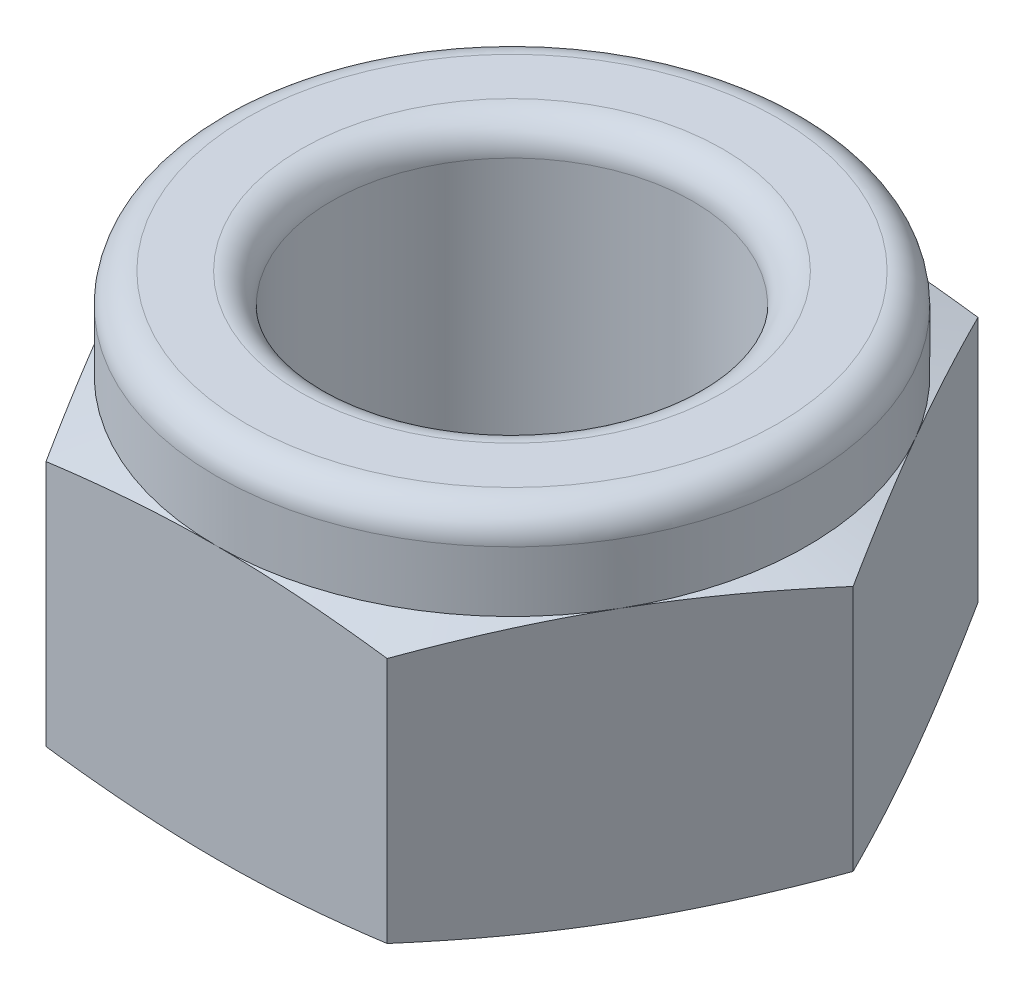
ISO-10303-21;
HEADER;
FILE_DESCRIPTION(('STEP AP214'),'2;1');
FILE_NAME('part.step','',(''),(''),'','','');
FILE_SCHEMA(('AUTOMOTIVE_DESIGN { 1 0 10303 214 1 1 1 1 }'));
ENDSEC;
DATA;
#1=APPLICATION_CONTEXT('core data for automotive mechanical design processes');
#2=APPLICATION_PROTOCOL_DEFINITION('international standard','automotive_design',2000,#1);
#3=PRODUCT_CONTEXT('',#1,'mechanical');
#4=PRODUCT('Part','Part','',(#3));
#5=PRODUCT_RELATED_PRODUCT_CATEGORY('part','',(#4));
#6=PRODUCT_DEFINITION_FORMATION('','',#4);
#7=PRODUCT_DEFINITION_CONTEXT('part definition',#1,'design');
#8=PRODUCT_DEFINITION('design','',#6,#7);
#9=PRODUCT_DEFINITION_SHAPE('','',#8);
#10=(LENGTH_UNIT() NAMED_UNIT(*) SI_UNIT(.MILLI.,.METRE.));
#11=(NAMED_UNIT(*) PLANE_ANGLE_UNIT() SI_UNIT($,.RADIAN.));
#12=(NAMED_UNIT(*) SI_UNIT($,.STERADIAN.) SOLID_ANGLE_UNIT());
#13=UNCERTAINTY_MEASURE_WITH_UNIT(LENGTH_MEASURE(1.E-05),#10,'distance_accuracy_value','');
#14=(GEOMETRIC_REPRESENTATION_CONTEXT(3) GLOBAL_UNCERTAINTY_ASSIGNED_CONTEXT((#13)) GLOBAL_UNIT_ASSIGNED_CONTEXT((#10,
#11,#12)) REPRESENTATION_CONTEXT('',''));
#15=CARTESIAN_POINT('',(0.,0.,0.));
#16=DIRECTION('',(0.,0.,1.));
#17=DIRECTION('',(1.,0.,0.));
#18=AXIS2_PLACEMENT_3D('',#15,#16,#17);
#19=CARTESIAN_POINT('',(2.82901631902917,2.25,4.9));
#20=DIRECTION('',(-0.866025403784439,0.,-0.5));
#21=DIRECTION('',(-0.5,0.,0.866025403784439));
#22=AXIS2_PLACEMENT_3D('',#19,#20,#21);
#23=PLANE('',#22);
#24=CARTESIAN_POINT('',(5.65814810811217,-2.04685482574104,-0.000199999999996387));
#25=CARTESIAN_POINT('',(5.54065660374499,-2.07835041652694,0.203301255021666));
#26=CARTESIAN_POINT('',(5.42295206823452,-2.10694325817324,0.407171490807086));
#27=CARTESIAN_POINT('',(5.18712729832681,-2.15717825137329,0.815631973970481));
#28=CARTESIAN_POINT('',(5.06900691470554,-2.17881757945266,1.02022247981204));
#29=CARTESIAN_POINT('',(4.83306664212638,-2.21388221078127,1.4288830194708));
#30=CARTESIAN_POINT('',(4.71524834873211,-2.22734933171967,1.63295028969074));
#31=CARTESIAN_POINT('',(4.47946150740952,-2.24540736758631,2.04134507861765));
#32=CARTESIAN_POINT('',(4.36149299297663,-2.25,2.24567253930882));
#33=CARTESIAN_POINT('',(4.12555596411087,-2.25,2.65432746069118));
#34=CARTESIAN_POINT('',(4.00758744967798,-2.24540736758631,2.85865492138235));
#35=CARTESIAN_POINT('',(3.77180060835539,-2.22734933171967,3.26704971030926));
#36=CARTESIAN_POINT('',(3.65398231496112,-2.21388221078127,3.47111698052921));
#37=CARTESIAN_POINT('',(3.41804204238195,-2.17881757945266,3.87977752018796));
#38=CARTESIAN_POINT('',(3.29992165876069,-2.15717825137329,4.08436802602952));
#39=CARTESIAN_POINT('',(3.06409688885298,-2.10694325817324,4.49282850919292));
#40=CARTESIAN_POINT('',(2.94639235334251,-2.07835041652694,4.69669874497834));
#41=CARTESIAN_POINT('',(2.82890084897533,-2.04685482574104,4.9002));
#42=B_SPLINE_CURVE_WITH_KNOTS('',3,(#24,#25,#26,#27,#28,#29,#30,#31,#32,#33,#34,#35,#36,#37,#38,
#39,#40,#41),.UNSPECIFIED.,.F.,.F.,(4,2,2,2,2,2,2,2,4),(0.,0.711290304723069,1.4228690650011,
2.13077523457241,2.83854438888412,3.54631354319584,4.25421971276715,4.96579847304517,
5.67708877776824),.UNSPECIFIED.);
#43=CARTESIAN_POINT('',(5.65803263805833,-2.04688576679584,0.));
#44=VERTEX_POINT('',#43);
#45=CARTESIAN_POINT('',(4.24352447854375,-2.25,2.45));
#46=VERTEX_POINT('',#45);
#47=EDGE_CURVE('E49',#44,#46,#42,.T.);
#48=ORIENTED_EDGE('',*,*,#47,.F.);
#49=DIRECTION('',(0.,-1.,0.));
#50=VECTOR('',#49,1.);
#51=CARTESIAN_POINT('',(5.65803263805833,2.25,0.));
#52=LINE('',#51,#50);
#53=CARTESIAN_POINT('',(5.65803263805833,2.04688576679584,0.));
#54=VERTEX_POINT('',#53);
#55=EDGE_CURVE('E314',#54,#44,#52,.T.);
#56=ORIENTED_EDGE('',*,*,#55,.F.);
#57=CARTESIAN_POINT('',(2.82890084897533,2.04685482574104,4.9002));
#58=CARTESIAN_POINT('',(2.94639235334251,2.07835041652694,4.69669874497834));
#59=CARTESIAN_POINT('',(3.06409688885298,2.10694325817324,4.49282850919291));
#60=CARTESIAN_POINT('',(3.29992165876069,2.15717825137329,4.08436802602952));
#61=CARTESIAN_POINT('',(3.41804204238196,2.17881757945266,3.87977752018796));
#62=CARTESIAN_POINT('',(3.65398231496112,2.21388221078127,3.47111698052921));
#63=CARTESIAN_POINT('',(3.77180060835539,2.22734933171967,3.26704971030926));
#64=CARTESIAN_POINT('',(4.00758744967798,2.24540736758631,2.85865492138235));
#65=CARTESIAN_POINT('',(4.12555596411087,2.25,2.65432746069118));
#66=CARTESIAN_POINT('',(4.36149299297663,2.25,2.24567253930882));
#67=CARTESIAN_POINT('',(4.47946150740952,2.24540736758631,2.04134507861765));
#68=CARTESIAN_POINT('',(4.71524834873211,2.22734933171967,1.63295028969074));
#69=CARTESIAN_POINT('',(4.83306664212639,2.21388221078127,1.42888301947079));
#70=CARTESIAN_POINT('',(5.06900691470555,2.17881757945266,1.02022247981204));
#71=CARTESIAN_POINT('',(5.18712729832681,2.15717825137329,0.81563197397048));
#72=CARTESIAN_POINT('',(5.42295206823452,2.10694325817324,0.407171490807085));
#73=CARTESIAN_POINT('',(5.54065660374499,2.07835041652693,0.203301255021665));
#74=CARTESIAN_POINT('',(5.65814810811217,2.04685482574104,-0.000199999999997785));
#75=B_SPLINE_CURVE_WITH_KNOTS('',3,(#57,#58,#59,#60,#61,#62,#63,#64,#65,#66,#67,#68,#69,#70,#71,
#72,#73,#74),.UNSPECIFIED.,.F.,.F.,(4,2,2,2,2,2,2,2,4),(0.,0.71129030472307,1.4228690650011,
2.13077523457241,2.83854438888412,3.54631354319584,4.25421971276715,4.96579847304517,
5.67708877776824),.UNSPECIFIED.);
#76=CARTESIAN_POINT('',(4.24352447854375,2.25,2.45));
#77=VERTEX_POINT('',#76);
#78=EDGE_CURVE('E144',#77,#54,#75,.T.);
#79=ORIENTED_EDGE('',*,*,#78,.F.);
#80=CARTESIAN_POINT('',(2.82901631902917,2.04688576679584,4.9));
#81=VERTEX_POINT('',#80);
#82=EDGE_CURVE('E158',#81,#77,#75,.T.);
#83=ORIENTED_EDGE('',*,*,#82,.F.);
#84=DIRECTION('',(0.,-1.,0.));
#85=VECTOR('',#84,1.);
#86=CARTESIAN_POINT('',(2.82901631902917,2.25,4.9));
#87=LINE('',#86,#85);
#88=CARTESIAN_POINT('',(2.82901631902917,-2.04688576679584,4.9));
#89=VERTEX_POINT('',#88);
#90=EDGE_CURVE('E164',#81,#89,#87,.T.);
#91=ORIENTED_EDGE('',*,*,#90,.T.);
#92=EDGE_CURVE('E272',#46,#89,#42,.T.);
#93=ORIENTED_EDGE('',*,*,#92,.F.);
#94=EDGE_LOOP('',(#48,#56,#79,#83,#91,#93));
#95=FACE_BOUND('',#94,.T.);
#96=ADVANCED_FACE('F34',(#95),#23,.F.);
#97=CARTESIAN_POINT('',(5.65803263805833,2.25,0.));
#98=DIRECTION('',(-0.866025403784438,0.,0.5));
#99=DIRECTION('',(0.5,0.,0.866025403784439));
#100=AXIS2_PLACEMENT_3D('',#97,#98,#99);
#101=PLANE('',#100);
#102=CARTESIAN_POINT('',(2.82890084897532,-2.04685482574104,-4.9002));
#103=CARTESIAN_POINT('',(2.94639235334251,-2.07835041652694,-4.69669874497834));
#104=CARTESIAN_POINT('',(3.06409688885297,-2.10694325817324,-4.49282850919292));
#105=CARTESIAN_POINT('',(3.29992165876068,-2.15717825137329,-4.08436802602952));
#106=CARTESIAN_POINT('',(3.41804204238195,-2.17881757945266,-3.87977752018796));
#107=CARTESIAN_POINT('',(3.65398231496111,-2.21388221078127,-3.47111698052921));
#108=CARTESIAN_POINT('',(3.77180060835539,-2.22734933171967,-3.26704971030926));
#109=CARTESIAN_POINT('',(4.00758744967798,-2.24540736758631,-2.85865492138235));
#110=CARTESIAN_POINT('',(4.12555596411086,-2.25,-2.65432746069117));
#111=CARTESIAN_POINT('',(4.36149299297663,-2.25,-2.24567253930882));
#112=CARTESIAN_POINT('',(4.47946150740951,-2.24540736758631,-2.04134507861764));
#113=CARTESIAN_POINT('',(4.71524834873211,-2.22734933171967,-1.63295028969073));
#114=CARTESIAN_POINT('',(4.83306664212638,-2.21388221078127,-1.42888301947079));
#115=CARTESIAN_POINT('',(5.06900691470554,-2.17881757945266,-1.02022247981203));
#116=CARTESIAN_POINT('',(5.18712729832681,-2.15717825137329,-0.815631973970474));
#117=CARTESIAN_POINT('',(5.42295206823452,-2.10694325817324,-0.407171490807079));
#118=CARTESIAN_POINT('',(5.54065660374499,-2.07835041652694,-0.203301255021658));
#119=CARTESIAN_POINT('',(5.65814810811217,-2.04685482574104,0.000200000000004888));
#120=B_SPLINE_CURVE_WITH_KNOTS('',3,(#102,#103,#104,#105,#106,#107,#108,#109,#110,#111,#112,
#113,#114,#115,#116,#117,#118,#119),.UNSPECIFIED.,.F.,.F.,(4,2,2,2,2,2,2,2,4),(0.,
0.711290304723071,1.4228690650011,2.13077523457242,2.83854438888413,3.54631354319584,
4.25421971276716,4.96579847304519,5.67708877776826),.UNSPECIFIED.);
#121=CARTESIAN_POINT('',(2.82901631902916,-2.04688576679584,-4.9));
#122=VERTEX_POINT('',#121);
#123=CARTESIAN_POINT('',(4.24352447854375,-2.25,-2.45));
#124=VERTEX_POINT('',#123);
#125=EDGE_CURVE('E57',#122,#124,#120,.T.);
#126=ORIENTED_EDGE('',*,*,#125,.F.);
#127=DIRECTION('',(0.,-1.,0.));
#128=VECTOR('',#127,1.);
#129=CARTESIAN_POINT('',(2.82901631902916,2.25,-4.9));
#130=LINE('',#129,#128);
#131=CARTESIAN_POINT('',(2.82901631902916,2.04688576679584,-4.9));
#132=VERTEX_POINT('',#131);
#133=EDGE_CURVE('E131',#132,#122,#130,.T.);
#134=ORIENTED_EDGE('',*,*,#133,.F.);
#135=CARTESIAN_POINT('',(5.65814810811217,2.04685482574104,0.000200000000003696));
#136=CARTESIAN_POINT('',(5.54065660374499,2.07835041652693,-0.20330125502166));
#137=CARTESIAN_POINT('',(5.42295206823452,2.10694325817324,-0.40717149080708));
#138=CARTESIAN_POINT('',(5.18712729832681,2.15717825137329,-0.815631973970475));
#139=CARTESIAN_POINT('',(5.06900691470554,2.17881757945266,-1.02022247981203));
#140=CARTESIAN_POINT('',(4.83306664212638,2.21388221078128,-1.42888301947079));
#141=CARTESIAN_POINT('',(4.71524834873211,2.22734933171967,-1.63295028969073));
#142=CARTESIAN_POINT('',(4.47946150740951,2.24540736758632,-2.04134507861765));
#143=CARTESIAN_POINT('',(4.36149299297663,2.25,-2.24567253930882));
#144=CARTESIAN_POINT('',(4.12555596411086,2.25,-2.65432746069118));
#145=CARTESIAN_POINT('',(4.00758744967798,2.24540736758631,-2.85865492138235));
#146=CARTESIAN_POINT('',(3.77180060835539,2.22734933171967,-3.26704971030926));
#147=CARTESIAN_POINT('',(3.65398231496111,2.21388221078127,-3.47111698052921));
#148=CARTESIAN_POINT('',(3.41804204238195,2.17881757945266,-3.87977752018796));
#149=CARTESIAN_POINT('',(3.29992165876068,2.15717825137329,-4.08436802602952));
#150=CARTESIAN_POINT('',(3.06409688885297,2.10694325817324,-4.49282850919292));
#151=CARTESIAN_POINT('',(2.94639235334251,2.07835041652693,-4.69669874497834));
#152=CARTESIAN_POINT('',(2.82890084897532,2.04685482574104,-4.9002));
#153=B_SPLINE_CURVE_WITH_KNOTS('',3,(#135,#136,#137,#138,#139,#140,#141,#142,#143,#144,#145,
#146,#147,#148,#149,#150,#151,#152),.UNSPECIFIED.,.F.,.F.,(4,2,2,2,2,2,2,2,4),(0.,
0.711290304723071,1.4228690650011,2.13077523457242,2.83854438888413,3.54631354319584,
4.25421971276716,4.96579847304519,5.67708877776826),.UNSPECIFIED.);
#154=CARTESIAN_POINT('',(4.24352447854375,2.25,-2.45));
#155=VERTEX_POINT('',#154);
#156=EDGE_CURVE('E124',#155,#132,#153,.T.);
#157=ORIENTED_EDGE('',*,*,#156,.F.);
#158=EDGE_CURVE('E128',#54,#155,#153,.T.);
#159=ORIENTED_EDGE('',*,*,#158,.F.);
#160=ORIENTED_EDGE('',*,*,#55,.T.);
#161=EDGE_CURVE('E256',#124,#44,#120,.T.);
#162=ORIENTED_EDGE('',*,*,#161,.F.);
#163=EDGE_LOOP('',(#126,#134,#157,#159,#160,#162));
#164=FACE_BOUND('',#163,.T.);
#165=ADVANCED_FACE('F126',(#164),#101,.F.);
#166=CARTESIAN_POINT('',(2.82901631902916,2.25,-4.9));
#167=DIRECTION('',(0.,0.,1.));
#168=DIRECTION('',(1.,0.,0.));
#169=AXIS2_PLACEMENT_3D('',#166,#167,#168);
#170=PLANE('',#169);
#171=CARTESIAN_POINT('',(-7.5054369258689,-1.16122954237772,-4.9));
#172=CARTESIAN_POINT('',(-7.28288924097298,-1.21114846308082,-4.9));
#173=CARTESIAN_POINT('',(-7.06020295678752,-1.26046048299816,-4.9));
#174=CARTESIAN_POINT('',(-6.61448507368936,-1.35754309367652,-4.9));
#175=CARTESIAN_POINT('',(-6.39145346043607,-1.40531361852061,-4.9));
#176=CARTESIAN_POINT('',(-5.94478009359562,-1.49902654736092,-4.9));
#177=CARTESIAN_POINT('',(-5.7211379586814,-1.54496714022768,-4.9));
#178=CARTESIAN_POINT('',(-5.27338976892989,-1.6345277899107,-4.9));
#179=CARTESIAN_POINT('',(-5.0492837179798,-1.67814786608963,-4.9));
#180=CARTESIAN_POINT('',(-4.60231235778098,-1.7621785296635,-4.9));
#181=CARTESIAN_POINT('',(-4.37945134801138,-1.80261187485217,-4.9));
#182=CARTESIAN_POINT('',(-3.93312263982553,-1.87997224824028,-4.9));
#183=CARTESIAN_POINT('',(-3.70965495476974,-1.91689935302167,-4.9));
#184=CARTESIAN_POINT('',(-3.26206689124958,-1.98642038758362,-4.9));
#185=CARTESIAN_POINT('',(-3.03794659033512,-2.019014812333,-4.9));
#186=CARTESIAN_POINT('',(-2.58899209930863,-2.07891392364868,-4.9));
#187=CARTESIAN_POINT('',(-2.36415790840365,-2.10621860433725,-4.9));
#188=CARTESIAN_POINT('',(-1.91122981039649,-2.15476982044963,-4.9));
#189=CARTESIAN_POINT('',(-1.68312799142318,-2.17594363931311,-4.9));
#190=CARTESIAN_POINT('',(-1.22634623883701,-2.21077529946704,-4.9));
#191=CARTESIAN_POINT('',(-0.997666318606688,-2.22443331316996,-4.9));
#192=CARTESIAN_POINT('',(-0.540060782632924,-2.2434370320707,-4.9));
#193=CARTESIAN_POINT('',(-0.311135330575895,-2.24878659938816,-4.9));
#194=CARTESIAN_POINT('',(0.146754913524524,-2.25084402689222,-4.9));
#195=CARTESIAN_POINT('',(0.375719705516388,-2.24755189831209,-4.9));
#196=CARTESIAN_POINT('',(0.83420308823679,-2.23251082440828,-4.9));
#197=CARTESIAN_POINT('',(1.06372064605975,-2.22073102625189,-4.9));
#198=CARTESIAN_POINT('',(1.52221885982155,-2.18938890121583,-4.9));
#199=CARTESIAN_POINT('',(1.75119950365337,-2.16982640050784,-4.9));
#200=CARTESIAN_POINT('',(2.20862157135318,-2.12391251189841,-4.9));
#201=CARTESIAN_POINT('',(2.43706253808558,-2.09755663975132,-4.9));
#202=CARTESIAN_POINT('',(2.89320832583137,-2.03915887985134,-4.9));
#203=CARTESIAN_POINT('',(3.1209131445754,-2.00711697458683,-4.9));
#204=CARTESIAN_POINT('',(3.56256742441858,-1.94035197182417,-4.9));
#205=CARTESIAN_POINT('',(3.77655647867271,-1.90588820731174,-4.9));
#206=CARTESIAN_POINT('',(4.20396323032523,-1.83356967831588,-4.9));
#207=CARTESIAN_POINT('',(4.41738091135425,-1.79571481772867,-4.9));
#208=CARTESIAN_POINT('',(5.05691212603055,-1.67803197479835,-4.9));
#209=CARTESIAN_POINT('',(5.48226711896831,-1.59409151524839,-4.9));
#210=CARTESIAN_POINT('',(6.33156278893474,-1.41892944234619,-4.9));
#211=CARTESIAN_POINT('',(6.75550307499435,-1.32770596596089,-4.9));
#212=CARTESIAN_POINT('',(7.60225616160464,-1.14030766812063,-4.9));
#213=CARTESIAN_POINT('',(8.02506902894189,-1.04413314713436,-4.9));
#214=CARTESIAN_POINT('',(8.86570282185178,-0.849288784608433,-4.9));
#215=CARTESIAN_POINT('',(9.28353170525342,-0.750653102083175,-4.9));
#216=CARTESIAN_POINT('',(10.1186087422897,-0.550924385720983,-4.9));
#217=CARTESIAN_POINT('',(10.5358568848238,-0.449831305575897,-4.9));
#218=CARTESIAN_POINT('',(11.3693813305856,-0.24596307612916,-4.9));
#219=CARTESIAN_POINT('',(11.7856581954372,-0.143190217843176,-4.9));
#220=CARTESIAN_POINT('',(12.6178512945702,0.0637470729808747,-4.9));
#221=CARTESIAN_POINT('',(13.0337675404932,0.167911458669871,-4.9));
#222=CARTESIAN_POINT('',(13.4495585721273,0.272567572072363,-4.9));
#223=B_SPLINE_CURVE_WITH_KNOTS('',3,(#171,#172,#173,#174,#175,#176,#177,#178,#179,#180,#181,
#182,#183,#184,#185,#186,#187,#188,#189,#190,#191,#192,#193,#194,#195,#196,#197,#198,#199,#200,
#201,#202,#203,#204,#205,#206,#207,#208,#209,#210,#211,#212,#213,#214,#215,#216,#217,#218,#219,
#220,#221,#222),.UNSPECIFIED.,.F.,.F.,(4,2,2,2,2,2,2,2,2,2,2,2,2,2,2,2,2,2,2,2,2,2,2,2,2,4),(0.,
0.684235419541623,1.36850005947968,2.05342590834599,2.73834604121506,3.41782126163834,
4.09728163781179,4.77666432505625,5.45604776719564,6.14318687683074,6.83031022284494,
7.51711406897127,8.20391702232817,8.89322919368399,9.58255676183898,10.2723405196473,
10.9621264018616,11.6123335262982,12.2625590834584,13.5631216540798,14.8640179878571,
16.1648354657769,17.4527661958893,18.7407212151108,20.0270460231587,21.3133276326314),.UNSPECIFIED.);
#224=CARTESIAN_POINT('',(-2.82901631902917,-2.04688576679584,-4.9));
#225=VERTEX_POINT('',#224);
#226=CARTESIAN_POINT('',(0.,-2.25,-4.9));
#227=VERTEX_POINT('',#226);
#228=EDGE_CURVE('E258',#225,#227,#223,.T.);
#229=ORIENTED_EDGE('',*,*,#228,.F.);
#230=DIRECTION('',(0.,-1.,0.));
#231=VECTOR('',#230,1.);
#232=CARTESIAN_POINT('',(-2.82901631902917,2.25,-4.9));
#233=LINE('',#232,#231);
#234=CARTESIAN_POINT('',(-2.82901631902917,2.04688576679584,-4.9));
#235=VERTEX_POINT('',#234);
#236=EDGE_CURVE('E318',#235,#225,#233,.T.);
#237=ORIENTED_EDGE('',*,*,#236,.F.);
#238=CARTESIAN_POINT('',(-7.5054369258689,1.16122954237772,-4.9));
#239=CARTESIAN_POINT('',(-7.28288924097298,1.21114846308082,-4.9));
#240=CARTESIAN_POINT('',(-7.06020295678752,1.26046048299816,-4.9));
#241=CARTESIAN_POINT('',(-6.61448507368936,1.35754309367652,-4.9));
#242=CARTESIAN_POINT('',(-6.39145346043607,1.40531361852061,-4.9));
#243=CARTESIAN_POINT('',(-5.94478009359562,1.49902654736092,-4.9));
#244=CARTESIAN_POINT('',(-5.7211379586814,1.54496714022768,-4.9));
#245=CARTESIAN_POINT('',(-5.27338976892989,1.6345277899107,-4.9));
#246=CARTESIAN_POINT('',(-5.0492837179798,1.67814786608963,-4.9));
#247=CARTESIAN_POINT('',(-4.60231235778098,1.7621785296635,-4.9));
#248=CARTESIAN_POINT('',(-4.37945134801138,1.80261187485217,-4.9));
#249=CARTESIAN_POINT('',(-3.93312263982553,1.87997224824028,-4.9));
#250=CARTESIAN_POINT('',(-3.70965495476974,1.91689935302167,-4.9));
#251=CARTESIAN_POINT('',(-3.26206689124958,1.98642038758362,-4.9));
#252=CARTESIAN_POINT('',(-3.03794659033512,2.019014812333,-4.9));
#253=CARTESIAN_POINT('',(-2.58899209930863,2.07891392364868,-4.9));
#254=CARTESIAN_POINT('',(-2.36415790840365,2.10621860433725,-4.9));
#255=CARTESIAN_POINT('',(-1.91122981039649,2.15476982044963,-4.9));
#256=CARTESIAN_POINT('',(-1.68312799142318,2.17594363931311,-4.9));
#257=CARTESIAN_POINT('',(-1.22634623883701,2.21077529946704,-4.9));
#258=CARTESIAN_POINT('',(-0.997666318606688,2.22443331316996,-4.9));
#259=CARTESIAN_POINT('',(-0.540060782632924,2.2434370320707,-4.9));
#260=CARTESIAN_POINT('',(-0.311135330575895,2.24878659938816,-4.9));
#261=CARTESIAN_POINT('',(0.146754913524524,2.25084402689222,-4.9));
#262=CARTESIAN_POINT('',(0.375719705516388,2.24755189831209,-4.9));
#263=CARTESIAN_POINT('',(0.83420308823679,2.23251082440828,-4.9));
#264=CARTESIAN_POINT('',(1.06372064605975,2.22073102625189,-4.9));
#265=CARTESIAN_POINT('',(1.52221885982155,2.18938890121583,-4.9));
#266=CARTESIAN_POINT('',(1.75119950365337,2.16982640050784,-4.9));
#267=CARTESIAN_POINT('',(2.20862157135318,2.12391251189841,-4.9));
#268=CARTESIAN_POINT('',(2.43706253808558,2.09755663975132,-4.9));
#269=CARTESIAN_POINT('',(2.89320832583137,2.03915887985134,-4.9));
#270=CARTESIAN_POINT('',(3.1209131445754,2.00711697458683,-4.9));
#271=CARTESIAN_POINT('',(3.56256742441858,1.94035197182417,-4.9));
#272=CARTESIAN_POINT('',(3.77655647867271,1.90588820731174,-4.9));
#273=CARTESIAN_POINT('',(4.20396323032523,1.83356967831588,-4.9));
#274=CARTESIAN_POINT('',(4.41738091135425,1.79571481772867,-4.9));
#275=CARTESIAN_POINT('',(5.05691212603055,1.67803197479835,-4.9));
#276=CARTESIAN_POINT('',(5.48226711896831,1.59409151524839,-4.9));
#277=CARTESIAN_POINT('',(6.33156278893474,1.41892944234619,-4.9));
#278=CARTESIAN_POINT('',(6.75550307499435,1.32770596596089,-4.9));
#279=CARTESIAN_POINT('',(7.60225616160464,1.14030766812063,-4.9));
#280=CARTESIAN_POINT('',(8.02506902894189,1.04413314713436,-4.9));
#281=CARTESIAN_POINT('',(8.86570282185178,0.849288784608433,-4.9));
#282=CARTESIAN_POINT('',(9.28353170525342,0.750653102083175,-4.9));
#283=CARTESIAN_POINT('',(10.1186087422897,0.550924385720983,-4.9));
#284=CARTESIAN_POINT('',(10.5358568848238,0.449831305575897,-4.9));
#285=CARTESIAN_POINT('',(11.3693813305856,0.24596307612916,-4.9));
#286=CARTESIAN_POINT('',(11.7856581954372,0.143190217843176,-4.9));
#287=CARTESIAN_POINT('',(12.6178512945702,-0.0637470729808747,-4.9));
#288=CARTESIAN_POINT('',(13.0337675404932,-0.167911458669871,-4.9));
#289=CARTESIAN_POINT('',(13.4495585721273,-0.272567572072363,-4.9));
#290=B_SPLINE_CURVE_WITH_KNOTS('',3,(#238,#239,#240,#241,#242,#243,#244,#245,#246,#247,#248,
#249,#250,#251,#252,#253,#254,#255,#256,#257,#258,#259,#260,#261,#262,#263,#264,#265,#266,#267,
#268,#269,#270,#271,#272,#273,#274,#275,#276,#277,#278,#279,#280,#281,#282,#283,#284,#285,#286,
#287,#288,#289),.UNSPECIFIED.,.F.,.F.,(4,2,2,2,2,2,2,2,2,2,2,2,2,2,2,2,2,2,2,2,2,2,2,2,2,4),(0.,
0.684235419541623,1.36850005947968,2.05342590834599,2.73834604121506,3.41782126163834,
4.09728163781179,4.77666432505625,5.45604776719564,6.14318687683074,6.83031022284494,
7.51711406897127,8.20391702232817,8.89322919368399,9.58255676183898,10.2723405196473,
10.9621264018616,11.6123335262982,12.2625590834584,13.5631216540798,14.8640179878571,
16.1648354657769,17.4527661958893,18.7407212151108,20.0270460231587,21.3133276326314),.UNSPECIFIED.);
#291=CARTESIAN_POINT('',(0.,2.25,-4.9));
#292=VERTEX_POINT('',#291);
#293=EDGE_CURVE('E170',#292,#235,#290,.F.);
#294=ORIENTED_EDGE('',*,*,#293,.F.);
#295=EDGE_CURVE('E136',#132,#292,#290,.F.);
#296=ORIENTED_EDGE('',*,*,#295,.F.);
#297=ORIENTED_EDGE('',*,*,#133,.T.);
#298=EDGE_CURVE('E257',#227,#122,#223,.T.);
#299=ORIENTED_EDGE('',*,*,#298,.F.);
#300=EDGE_LOOP('',(#229,#237,#294,#296,#297,#299));
#301=FACE_BOUND('',#300,.T.);
#302=ADVANCED_FACE('F247',(#301),#170,.F.);
#303=CARTESIAN_POINT('',(-2.82901631902917,2.25,-4.9));
#304=DIRECTION('',(0.866025403784439,0.,0.5));
#305=DIRECTION('',(0.5,0.,-0.866025403784439));
#306=AXIS2_PLACEMENT_3D('',#303,#304,#305);
#307=PLANE('',#306);
#308=CARTESIAN_POINT('',(-5.65814810811217,-2.04685482574104,0.000199999999998477));
#309=CARTESIAN_POINT('',(-5.54065660374499,-2.07835041652693,-0.203301255021664));
#310=CARTESIAN_POINT('',(-5.42295206823452,-2.10694325817324,-0.407171490807084));
#311=CARTESIAN_POINT('',(-5.18712729832681,-2.15717825137329,-0.81563197397048));
#312=CARTESIAN_POINT('',(-5.06900691470555,-2.17881757945266,-1.02022247981204));
#313=CARTESIAN_POINT('',(-4.83306664212639,-2.21388221078127,-1.42888301947079));
#314=CARTESIAN_POINT('',(-4.71524834873211,-2.22734933171967,-1.63295028969074));
#315=CARTESIAN_POINT('',(-4.47946150740952,-2.24540736758631,-2.04134507861765));
#316=CARTESIAN_POINT('',(-4.36149299297663,-2.25,-2.24567253930883));
#317=CARTESIAN_POINT('',(-4.12555596411087,-2.25,-2.65432746069118));
#318=CARTESIAN_POINT('',(-4.00758744967798,-2.24540736758631,-2.85865492138235));
#319=CARTESIAN_POINT('',(-3.77180060835539,-2.22734933171966,-3.26704971030927));
#320=CARTESIAN_POINT('',(-3.65398231496112,-2.21388221078127,-3.47111698052921));
#321=CARTESIAN_POINT('',(-3.41804204238195,-2.17881757945266,-3.87977752018796));
#322=CARTESIAN_POINT('',(-3.29992165876069,-2.15717825137329,-4.08436802602952));
#323=CARTESIAN_POINT('',(-3.06409688885298,-2.10694325817324,-4.49282850919292));
#324=CARTESIAN_POINT('',(-2.94639235334251,-2.07835041652693,-4.69669874497834));
#325=CARTESIAN_POINT('',(-2.82890084897533,-2.04685482574104,-4.9002));
#326=B_SPLINE_CURVE_WITH_KNOTS('',3,(#308,#309,#310,#311,#312,#313,#314,#315,#316,#317,#318,
#319,#320,#321,#322,#323,#324,#325),.UNSPECIFIED.,.F.,.F.,(4,2,2,2,2,2,2,2,4),(0.,
0.71129030472307,1.4228690650011,2.13077523457241,2.83854438888412,3.54631354319584,
4.25421971276715,4.96579847304518,5.67708877776825),.UNSPECIFIED.);
#327=CARTESIAN_POINT('',(-5.65803263805833,-2.04688576679584,0.));
#328=VERTEX_POINT('',#327);
#329=CARTESIAN_POINT('',(-4.24352447854375,-2.25,-2.45));
#330=VERTEX_POINT('',#329);
#331=EDGE_CURVE('E265',#328,#330,#326,.T.);
#332=ORIENTED_EDGE('',*,*,#331,.F.);
#333=DIRECTION('',(0.,-1.,0.));
#334=VECTOR('',#333,1.);
#335=CARTESIAN_POINT('',(-5.65803263805833,2.25,0.));
#336=LINE('',#335,#334);
#337=CARTESIAN_POINT('',(-5.65803263805833,2.04688576679584,0.));
#338=VERTEX_POINT('',#337);
#339=EDGE_CURVE('E183',#338,#328,#336,.T.);
#340=ORIENTED_EDGE('',*,*,#339,.F.);
#341=CARTESIAN_POINT('',(-2.82890084897533,2.04685482574104,-4.9002));
#342=CARTESIAN_POINT('',(-2.94639235334251,2.07835041652693,-4.69669874497834));
#343=CARTESIAN_POINT('',(-3.06409688885298,2.10694325817324,-4.49282850919292));
#344=CARTESIAN_POINT('',(-3.29992165876069,2.15717825137329,-4.08436802602952));
#345=CARTESIAN_POINT('',(-3.41804204238195,2.17881757945266,-3.87977752018796));
#346=CARTESIAN_POINT('',(-3.65398231496112,2.21388221078127,-3.47111698052921));
#347=CARTESIAN_POINT('',(-3.77180060835539,2.22734933171967,-3.26704971030926));
#348=CARTESIAN_POINT('',(-4.00758744967798,2.24540736758631,-2.85865492138235));
#349=CARTESIAN_POINT('',(-4.12555596411087,2.25,-2.65432746069118));
#350=CARTESIAN_POINT('',(-4.36149299297663,2.25,-2.24567253930882));
#351=CARTESIAN_POINT('',(-4.47946150740952,2.24540736758631,-2.04134507861765));
#352=CARTESIAN_POINT('',(-4.71524834873211,2.22734933171967,-1.63295028969074));
#353=CARTESIAN_POINT('',(-4.83306664212639,2.21388221078127,-1.42888301947079));
#354=CARTESIAN_POINT('',(-5.06900691470555,2.17881757945266,-1.02022247981204));
#355=CARTESIAN_POINT('',(-5.18712729832681,2.15717825137329,-0.81563197397048));
#356=CARTESIAN_POINT('',(-5.42295206823452,2.10694325817324,-0.407171490807084));
#357=CARTESIAN_POINT('',(-5.54065660374499,2.07835041652693,-0.203301255021664));
#358=CARTESIAN_POINT('',(-5.65814810811217,2.04685482574104,0.00019999999999937));
#359=B_SPLINE_CURVE_WITH_KNOTS('',3,(#341,#342,#343,#344,#345,#346,#347,#348,#349,#350,#351,
#352,#353,#354,#355,#356,#357,#358),.UNSPECIFIED.,.F.,.F.,(4,2,2,2,2,2,2,2,4),(0.,
0.71129030472307,1.4228690650011,2.13077523457241,2.83854438888413,3.54631354319584,
4.25421971276715,4.96579847304518,5.67708877776825),.UNSPECIFIED.);
#360=CARTESIAN_POINT('',(-4.24352447854375,2.25,-2.45));
#361=VERTEX_POINT('',#360);
#362=EDGE_CURVE('E177',#361,#338,#359,.T.);
#363=ORIENTED_EDGE('',*,*,#362,.F.);
#364=EDGE_CURVE('E172',#235,#361,#359,.T.);
#365=ORIENTED_EDGE('',*,*,#364,.F.);
#366=ORIENTED_EDGE('',*,*,#236,.T.);
#367=EDGE_CURVE('E264',#330,#225,#326,.T.);
#368=ORIENTED_EDGE('',*,*,#367,.F.);
#369=EDGE_LOOP('',(#332,#340,#363,#365,#366,#368));
#370=FACE_BOUND('',#369,.T.);
#371=ADVANCED_FACE('F181',(#370),#307,.F.);
#372=CARTESIAN_POINT('',(-5.65803263805833,2.25,0.));
#373=DIRECTION('',(0.866025403784439,0.,-0.5));
#374=DIRECTION('',(-0.5,0.,-0.866025403784439));
#375=AXIS2_PLACEMENT_3D('',#372,#373,#374);
#376=PLANE('',#375);
#377=CARTESIAN_POINT('',(-2.82890084897533,-2.04685482574104,4.9002));
#378=CARTESIAN_POINT('',(-2.94639235334251,-2.07835041652694,4.69669874497834));
#379=CARTESIAN_POINT('',(-3.06409688885298,-2.10694325817324,4.49282850919292));
#380=CARTESIAN_POINT('',(-3.29992165876069,-2.15717825137329,4.08436802602952));
#381=CARTESIAN_POINT('',(-3.41804204238195,-2.17881757945266,3.87977752018796));
#382=CARTESIAN_POINT('',(-3.65398231496112,-2.21388221078127,3.47111698052921));
#383=CARTESIAN_POINT('',(-3.77180060835539,-2.22734933171967,3.26704971030926));
#384=CARTESIAN_POINT('',(-4.00758744967798,-2.24540736758631,2.85865492138235));
#385=CARTESIAN_POINT('',(-4.12555596411087,-2.25,2.65432746069118));
#386=CARTESIAN_POINT('',(-4.36149299297663,-2.25,2.24567253930882));
#387=CARTESIAN_POINT('',(-4.47946150740952,-2.24540736758631,2.04134507861765));
#388=CARTESIAN_POINT('',(-4.71524834873211,-2.22734933171967,1.63295028969073));
#389=CARTESIAN_POINT('',(-4.83306664212639,-2.21388221078127,1.42888301947079));
#390=CARTESIAN_POINT('',(-5.06900691470555,-2.17881757945266,1.02022247981204));
#391=CARTESIAN_POINT('',(-5.18712729832681,-2.15717825137329,0.815631973970477));
#392=CARTESIAN_POINT('',(-5.42295206823452,-2.10694325817324,0.407171490807082));
#393=CARTESIAN_POINT('',(-5.54065660374499,-2.07835041652693,0.203301255021661));
#394=CARTESIAN_POINT('',(-5.65814810811217,-2.04685482574104,-0.000200000000002148));
#395=B_SPLINE_CURVE_WITH_KNOTS('',3,(#377,#378,#379,#380,#381,#382,#383,#384,#385,#386,#387,
#388,#389,#390,#391,#392,#393,#394),.UNSPECIFIED.,.F.,.F.,(4,2,2,2,2,2,2,2,4),(0.,
0.71129030472307,1.4228690650011,2.13077523457241,2.83854438888413,3.54631354319584,
4.25421971276715,4.96579847304518,5.67708877776825),.UNSPECIFIED.);
#396=CARTESIAN_POINT('',(-2.82901631902917,-2.04688576679584,4.9));
#397=VERTEX_POINT('',#396);
#398=CARTESIAN_POINT('',(-4.24352447854375,-2.25,2.45000000000001));
#399=VERTEX_POINT('',#398);
#400=EDGE_CURVE('E279',#397,#399,#395,.T.);
#401=ORIENTED_EDGE('',*,*,#400,.F.);
#402=DIRECTION('',(0.,-1.,0.));
#403=VECTOR('',#402,1.);
#404=CARTESIAN_POINT('',(-2.82901631902917,2.25,4.9));
#405=LINE('',#404,#403);
#406=CARTESIAN_POINT('',(-2.82901631902917,2.04688576679584,4.9));
#407=VERTEX_POINT('',#406);
#408=EDGE_CURVE('E323',#407,#397,#405,.T.);
#409=ORIENTED_EDGE('',*,*,#408,.F.);
#410=CARTESIAN_POINT('',(-5.65814810811217,2.04685482574104,-0.000200000000001809));
#411=CARTESIAN_POINT('',(-5.54065660374499,2.07835041652694,0.203301255021661));
#412=CARTESIAN_POINT('',(-5.42295206823452,2.10694325817324,0.407171490807081));
#413=CARTESIAN_POINT('',(-5.18712729832681,2.15717825137329,0.815631973970477));
#414=CARTESIAN_POINT('',(-5.06900691470555,2.17881757945266,1.02022247981204));
#415=CARTESIAN_POINT('',(-4.83306664212639,2.21388221078127,1.42888301947079));
#416=CARTESIAN_POINT('',(-4.71524834873211,2.22734933171967,1.63295028969073));
#417=CARTESIAN_POINT('',(-4.47946150740952,2.24540736758631,2.04134507861765));
#418=CARTESIAN_POINT('',(-4.36149299297663,2.25,2.24567253930882));
#419=CARTESIAN_POINT('',(-4.12555596411087,2.25,2.65432746069118));
#420=CARTESIAN_POINT('',(-4.00758744967798,2.24540736758631,2.85865492138235));
#421=CARTESIAN_POINT('',(-3.77180060835539,2.22734933171967,3.26704971030926));
#422=CARTESIAN_POINT('',(-3.65398231496111,2.21388221078127,3.47111698052921));
#423=CARTESIAN_POINT('',(-3.41804204238195,2.17881757945266,3.87977752018796));
#424=CARTESIAN_POINT('',(-3.29992165876069,2.15717825137329,4.08436802602952));
#425=CARTESIAN_POINT('',(-3.06409688885298,2.10694325817324,4.49282850919292));
#426=CARTESIAN_POINT('',(-2.94639235334251,2.07835041652694,4.69669874497834));
#427=CARTESIAN_POINT('',(-2.82890084897533,2.04685482574104,4.9002));
#428=B_SPLINE_CURVE_WITH_KNOTS('',3,(#410,#411,#412,#413,#414,#415,#416,#417,#418,#419,#420,
#421,#422,#423,#424,#425,#426,#427),.UNSPECIFIED.,.F.,.F.,(4,2,2,2,2,2,2,2,4),(0.,
0.711290304723071,1.4228690650011,2.13077523457241,2.83854438888413,3.54631354319584,
4.25421971276715,4.96579847304518,5.67708877776825),.UNSPECIFIED.);
#429=CARTESIAN_POINT('',(-4.24352447854375,2.25,2.45));
#430=VERTEX_POINT('',#429);
#431=EDGE_CURVE('E188',#430,#407,#428,.T.);
#432=ORIENTED_EDGE('',*,*,#431,.F.);
#433=EDGE_CURVE('E187',#338,#430,#428,.T.);
#434=ORIENTED_EDGE('',*,*,#433,.F.);
#435=ORIENTED_EDGE('',*,*,#339,.T.);
#436=EDGE_CURVE('E271',#399,#328,#395,.T.);
#437=ORIENTED_EDGE('',*,*,#436,.F.);
#438=EDGE_LOOP('',(#401,#409,#432,#434,#435,#437));
#439=FACE_BOUND('',#438,.T.);
#440=ADVANCED_FACE('F291',(#439),#376,.F.);
#441=CARTESIAN_POINT('',(-2.82901631902917,2.25,4.9));
#442=DIRECTION('',(0.,0.,-1.));
#443=DIRECTION('',(-1.,0.,0.));
#444=AXIS2_PLACEMENT_3D('',#441,#442,#443);
#445=PLANE('',#444);
#446=CARTESIAN_POINT('',(-7.50543692586889,-1.16122954237772,4.9));
#447=CARTESIAN_POINT('',(-7.28288924097297,-1.21114846308082,4.9));
#448=CARTESIAN_POINT('',(-7.06020295678751,-1.26046048299816,4.9));
#449=CARTESIAN_POINT('',(-6.61448507368935,-1.35754309367652,4.9));
#450=CARTESIAN_POINT('',(-6.39145346043606,-1.40531361852061,4.9));
#451=CARTESIAN_POINT('',(-5.94478009359561,-1.49902654736092,4.9));
#452=CARTESIAN_POINT('',(-5.72113795868139,-1.54496714022768,4.9));
#453=CARTESIAN_POINT('',(-5.27338976892988,-1.6345277899107,4.9));
#454=CARTESIAN_POINT('',(-5.04928371797979,-1.67814786608963,4.9));
#455=CARTESIAN_POINT('',(-4.60231235778097,-1.7621785296635,4.9));
#456=CARTESIAN_POINT('',(-4.37945134801138,-1.80261187485217,4.9));
#457=CARTESIAN_POINT('',(-3.93312263982552,-1.87997224824028,4.9));
#458=CARTESIAN_POINT('',(-3.70965495476973,-1.91689935302167,4.9));
#459=CARTESIAN_POINT('',(-3.26206689124957,-1.98642038758362,4.9));
#460=CARTESIAN_POINT('',(-3.03794659033511,-2.019014812333,4.9));
#461=CARTESIAN_POINT('',(-2.58899209930863,-2.07891392364868,4.9));
#462=CARTESIAN_POINT('',(-2.36415790840365,-2.10621860433725,4.9));
#463=CARTESIAN_POINT('',(-1.91122981039649,-2.15476982044963,4.9));
#464=CARTESIAN_POINT('',(-1.68312799142318,-2.17594363931311,4.9));
#465=CARTESIAN_POINT('',(-1.22634623883701,-2.21077529946704,4.9));
#466=CARTESIAN_POINT('',(-0.997666318606688,-2.22443331316997,4.9));
#467=CARTESIAN_POINT('',(-0.540060782632925,-2.2434370320707,4.9));
#468=CARTESIAN_POINT('',(-0.311135330575896,-2.24878659938816,4.9));
#469=CARTESIAN_POINT('',(0.146754913524521,-2.25084402689223,4.9));
#470=CARTESIAN_POINT('',(0.375719705516385,-2.24755189831209,4.9));
#471=CARTESIAN_POINT('',(0.834203088236787,-2.23251082440828,4.9));
#472=CARTESIAN_POINT('',(1.06372064605975,-2.22073102625189,4.9));
#473=CARTESIAN_POINT('',(1.52221885982154,-2.18938890121584,4.9));
#474=CARTESIAN_POINT('',(1.75119950365337,-2.16982640050785,4.9));
#475=CARTESIAN_POINT('',(2.20862157135318,-2.12391251189841,4.9));
#476=CARTESIAN_POINT('',(2.43706253808558,-2.09755663975132,4.9));
#477=CARTESIAN_POINT('',(2.89320832583137,-2.03915887985134,4.9));
#478=CARTESIAN_POINT('',(3.1209131445754,-2.00711697458683,4.9));
#479=CARTESIAN_POINT('',(3.56256742441857,-1.94035197182417,4.9));
#480=CARTESIAN_POINT('',(3.7765564786727,-1.90588820731174,4.9));
#481=CARTESIAN_POINT('',(4.20396323032523,-1.83356967831588,4.9));
#482=CARTESIAN_POINT('',(4.41738091135425,-1.79571481772867,4.9));
#483=CARTESIAN_POINT('',(5.05691212603055,-1.67803197479836,4.9));
#484=CARTESIAN_POINT('',(5.48226711896831,-1.59409151524839,4.9));
#485=CARTESIAN_POINT('',(6.33156278893474,-1.41892944234619,4.9));
#486=CARTESIAN_POINT('',(6.75550307499435,-1.32770596596089,4.9));
#487=CARTESIAN_POINT('',(7.60225616160464,-1.14030766812064,4.9));
#488=CARTESIAN_POINT('',(8.02506902894189,-1.04413314713436,4.9));
#489=CARTESIAN_POINT('',(8.86570282185179,-0.849288784608433,4.9));
#490=CARTESIAN_POINT('',(9.28353170525343,-0.750653102083175,4.9));
#491=CARTESIAN_POINT('',(10.1186087422897,-0.550924385720983,4.9));
#492=CARTESIAN_POINT('',(10.5358568848238,-0.449831305575897,4.9));
#493=CARTESIAN_POINT('',(11.3693813305856,-0.245963076129159,4.9));
#494=CARTESIAN_POINT('',(11.7856581954372,-0.143190217843175,4.9));
#495=CARTESIAN_POINT('',(12.6178512945702,0.0637470729808753,4.9));
#496=CARTESIAN_POINT('',(13.0337675404932,0.167911458669872,4.9));
#497=CARTESIAN_POINT('',(13.4495585721273,0.272567572072364,4.9));
#498=B_SPLINE_CURVE_WITH_KNOTS('',3,(#446,#447,#448,#449,#450,#451,#452,#453,#454,#455,#456,
#457,#458,#459,#460,#461,#462,#463,#464,#465,#466,#467,#468,#469,#470,#471,#472,#473,#474,#475,
#476,#477,#478,#479,#480,#481,#482,#483,#484,#485,#486,#487,#488,#489,#490,#491,#492,#493,#494,
#495,#496,#497),.UNSPECIFIED.,.F.,.F.,(4,2,2,2,2,2,2,2,2,2,2,2,2,2,2,2,2,2,2,2,2,2,2,2,2,4),(0.,
0.684235419541621,1.36850005947968,2.05342590834599,2.73834604121506,3.41782126163834,
4.09728163781179,4.77666432505624,5.45604776719563,6.14318687683073,6.83031022284493,
7.51711406897126,8.20391702232816,8.89322919368398,9.58255676183897,10.2723405196473,
10.9621264018616,11.6123335262982,12.2625590834584,13.5631216540798,14.8640179878571,
16.1648354657769,17.4527661958893,18.7407212151108,20.0270460231587,21.3133276326314),.UNSPECIFIED.);
#499=CARTESIAN_POINT('',(0.,-2.25,4.9));
#500=VERTEX_POINT('',#499);
#501=EDGE_CURVE('E278',#89,#500,#498,.F.);
#502=ORIENTED_EDGE('',*,*,#501,.F.);
#503=ORIENTED_EDGE('',*,*,#90,.F.);
#504=CARTESIAN_POINT('',(-7.50543692586889,1.16122954237772,4.9));
#505=CARTESIAN_POINT('',(-7.28288924097297,1.21114846308082,4.9));
#506=CARTESIAN_POINT('',(-7.06020295678751,1.26046048299816,4.9));
#507=CARTESIAN_POINT('',(-6.61448507368935,1.35754309367652,4.9));
#508=CARTESIAN_POINT('',(-6.39145346043606,1.40531361852061,4.9));
#509=CARTESIAN_POINT('',(-5.94478009359561,1.49902654736092,4.9));
#510=CARTESIAN_POINT('',(-5.72113795868139,1.54496714022768,4.9));
#511=CARTESIAN_POINT('',(-5.27338976892988,1.6345277899107,4.9));
#512=CARTESIAN_POINT('',(-5.04928371797979,1.67814786608963,4.9));
#513=CARTESIAN_POINT('',(-4.60231235778097,1.7621785296635,4.9));
#514=CARTESIAN_POINT('',(-4.37945134801138,1.80261187485217,4.9));
#515=CARTESIAN_POINT('',(-3.93312263982552,1.87997224824028,4.9));
#516=CARTESIAN_POINT('',(-3.70965495476973,1.91689935302167,4.9));
#517=CARTESIAN_POINT('',(-3.26206689124957,1.98642038758362,4.9));
#518=CARTESIAN_POINT('',(-3.03794659033511,2.019014812333,4.9));
#519=CARTESIAN_POINT('',(-2.58899209930863,2.07891392364868,4.9));
#520=CARTESIAN_POINT('',(-2.36415790840365,2.10621860433725,4.9));
#521=CARTESIAN_POINT('',(-1.91122981039649,2.15476982044963,4.9));
#522=CARTESIAN_POINT('',(-1.68312799142318,2.17594363931311,4.9));
#523=CARTESIAN_POINT('',(-1.22634623883701,2.21077529946704,4.9));
#524=CARTESIAN_POINT('',(-0.997666318606688,2.22443331316997,4.9));
#525=CARTESIAN_POINT('',(-0.540060782632925,2.2434370320707,4.9));
#526=CARTESIAN_POINT('',(-0.311135330575896,2.24878659938816,4.9));
#527=CARTESIAN_POINT('',(0.146754913524521,2.25084402689223,4.9));
#528=CARTESIAN_POINT('',(0.375719705516385,2.24755189831209,4.9));
#529=CARTESIAN_POINT('',(0.834203088236787,2.23251082440828,4.9));
#530=CARTESIAN_POINT('',(1.06372064605975,2.22073102625189,4.9));
#531=CARTESIAN_POINT('',(1.52221885982154,2.18938890121584,4.9));
#532=CARTESIAN_POINT('',(1.75119950365337,2.16982640050785,4.9));
#533=CARTESIAN_POINT('',(2.20862157135318,2.12391251189841,4.9));
#534=CARTESIAN_POINT('',(2.43706253808558,2.09755663975132,4.9));
#535=CARTESIAN_POINT('',(2.89320832583137,2.03915887985134,4.9));
#536=CARTESIAN_POINT('',(3.1209131445754,2.00711697458683,4.9));
#537=CARTESIAN_POINT('',(3.56256742441857,1.94035197182417,4.9));
#538=CARTESIAN_POINT('',(3.7765564786727,1.90588820731174,4.9));
#539=CARTESIAN_POINT('',(4.20396323032523,1.83356967831588,4.9));
#540=CARTESIAN_POINT('',(4.41738091135425,1.79571481772867,4.9));
#541=CARTESIAN_POINT('',(5.05691212603055,1.67803197479836,4.9));
#542=CARTESIAN_POINT('',(5.48226711896831,1.59409151524839,4.9));
#543=CARTESIAN_POINT('',(6.33156278893474,1.41892944234619,4.9));
#544=CARTESIAN_POINT('',(6.75550307499435,1.32770596596089,4.9));
#545=CARTESIAN_POINT('',(7.60225616160464,1.14030766812064,4.9));
#546=CARTESIAN_POINT('',(8.02506902894189,1.04413314713436,4.9));
#547=CARTESIAN_POINT('',(8.86570282185179,0.849288784608433,4.9));
#548=CARTESIAN_POINT('',(9.28353170525343,0.750653102083175,4.9));
#549=CARTESIAN_POINT('',(10.1186087422897,0.550924385720983,4.9));
#550=CARTESIAN_POINT('',(10.5358568848238,0.449831305575897,4.9));
#551=CARTESIAN_POINT('',(11.3693813305856,0.245963076129159,4.9));
#552=CARTESIAN_POINT('',(11.7856581954372,0.143190217843175,4.9));
#553=CARTESIAN_POINT('',(12.6178512945702,-0.0637470729808753,4.9));
#554=CARTESIAN_POINT('',(13.0337675404932,-0.167911458669872,4.9));
#555=CARTESIAN_POINT('',(13.4495585721273,-0.272567572072364,4.9));
#556=B_SPLINE_CURVE_WITH_KNOTS('',3,(#504,#505,#506,#507,#508,#509,#510,#511,#512,#513,#514,
#515,#516,#517,#518,#519,#520,#521,#522,#523,#524,#525,#526,#527,#528,#529,#530,#531,#532,#533,
#534,#535,#536,#537,#538,#539,#540,#541,#542,#543,#544,#545,#546,#547,#548,#549,#550,#551,#552,
#553,#554,#555),.UNSPECIFIED.,.F.,.F.,(4,2,2,2,2,2,2,2,2,2,2,2,2,2,2,2,2,2,2,2,2,2,2,2,2,4),(0.,
0.684235419541621,1.36850005947968,2.05342590834599,2.73834604121506,3.41782126163834,
4.09728163781179,4.77666432505624,5.45604776719563,6.14318687683073,6.83031022284493,
7.51711406897126,8.20391702232816,8.89322919368398,9.58255676183897,10.2723405196473,
10.9621264018616,11.6123335262982,12.2625590834584,13.5631216540798,14.8640179878571,
16.1648354657769,17.4527661958893,18.7407212151108,20.0270460231587,21.3133276326314),.UNSPECIFIED.);
#557=CARTESIAN_POINT('',(0.,2.25,4.9));
#558=VERTEX_POINT('',#557);
#559=EDGE_CURVE('E224',#558,#81,#556,.T.);
#560=ORIENTED_EDGE('',*,*,#559,.F.);
#561=EDGE_CURVE('E317',#407,#558,#556,.T.);
#562=ORIENTED_EDGE('',*,*,#561,.F.);
#563=ORIENTED_EDGE('',*,*,#408,.T.);
#564=EDGE_CURVE('E286',#500,#397,#498,.F.);
#565=ORIENTED_EDGE('',*,*,#564,.F.);
#566=EDGE_LOOP('',(#502,#503,#560,#562,#563,#565));
#567=FACE_BOUND('',#566,.T.);
#568=ADVANCED_FACE('F294',(#567),#445,.F.);
#569=CARTESIAN_POINT('',(0.,-2.25,0.));
#570=DIRECTION('',(0.,1.,0.));
#571=DIRECTION('',(0.,0.,1.));
#572=AXIS2_PLACEMENT_3D('',#569,#570,#571);
#573=PLANE('',#572);
#574=CARTESIAN_POINT('',(0.,-2.25,0.));
#575=DIRECTION('',(0.,1.,0.));
#576=DIRECTION('',(0.,0.,1.));
#577=AXIS2_PLACEMENT_3D('',#574,#575,#576);
#578=CIRCLE('',#577,3.);
#579=CARTESIAN_POINT('',(0.,-2.25,3.));
#580=VERTEX_POINT('',#579);
#581=EDGE_CURVE('E161',#580,#580,#578,.T.);
#582=ORIENTED_EDGE('',*,*,#581,.T.);
#583=EDGE_LOOP('',(#582));
#584=FACE_BOUND('',#583,.T.);
#585=CARTESIAN_POINT('',(0.,-2.25,0.));
#586=DIRECTION('',(0.,1.,0.));
#587=DIRECTION('',(0.,0.,1.));
#588=AXIS2_PLACEMENT_3D('',#585,#586,#587);
#589=CIRCLE('',#588,4.9);
#590=EDGE_CURVE('E345',#500,#46,#589,.T.);
#591=ORIENTED_EDGE('',*,*,#590,.F.);
#592=EDGE_CURVE('E338',#399,#500,#589,.T.);
#593=ORIENTED_EDGE('',*,*,#592,.F.);
#594=EDGE_CURVE('E344',#330,#399,#589,.T.);
#595=ORIENTED_EDGE('',*,*,#594,.F.);
#596=EDGE_CURVE('E346',#227,#330,#589,.T.);
#597=ORIENTED_EDGE('',*,*,#596,.F.);
#598=EDGE_CURVE('E353',#124,#227,#589,.T.);
#599=ORIENTED_EDGE('',*,*,#598,.F.);
#600=EDGE_CURVE('E349',#46,#124,#589,.T.);
#601=ORIENTED_EDGE('',*,*,#600,.F.);
#602=EDGE_LOOP('',(#591,#593,#595,#597,#599,#601));
#603=FACE_BOUND('',#602,.T.);
#604=ADVANCED_FACE('F299',(#584,#603),#573,.F.);
#605=CARTESIAN_POINT('',(0.,2.25,0.));
#606=DIRECTION('',(0.,-1.,0.));
#607=DIRECTION('',(0.,0.,-1.));
#608=AXIS2_PLACEMENT_3D('',#605,#606,#607);
#609=CYLINDRICAL_SURFACE('',#608,3.);
#610=CARTESIAN_POINT('',(0.,3.25,0.));
#611=DIRECTION('',(0.,1.,0.));
#612=DIRECTION('',(0.,0.,1.));
#613=AXIS2_PLACEMENT_3D('',#610,#611,#612);
#614=CIRCLE('',#613,3.);
#615=CARTESIAN_POINT('',(0.,3.25,3.));
#616=VERTEX_POINT('',#615);
#617=EDGE_CURVE('E348',#616,#616,#614,.T.);
#618=ORIENTED_EDGE('',*,*,#617,.T.);
#619=EDGE_LOOP('',(#618));
#620=FACE_BOUND('',#619,.T.);
#621=ORIENTED_EDGE('',*,*,#581,.F.);
#622=EDGE_LOOP('',(#621));
#623=FACE_BOUND('',#622,.T.);
#624=ADVANCED_FACE('F215',(#620,#623),#609,.F.);
#625=CARTESIAN_POINT('',(0.,3.56295104291249,0.));
#626=DIRECTION('',(0.,-1.,0.));
#627=DIRECTION('',(0.,0.,-1.));
#628=AXIS2_PLACEMENT_3D('',#625,#626,#627);
#629=CONICAL_SURFACE('',#628,0.,1.30899693899575);
#630=ORIENTED_EDGE('',*,*,#559,.T.);
#631=ORIENTED_EDGE('',*,*,#82,.T.);
#632=CARTESIAN_POINT('',(0.,2.25,0.));
#633=DIRECTION('',(0.,1.,0.));
#634=DIRECTION('',(0.,0.,1.));
#635=AXIS2_PLACEMENT_3D('',#632,#633,#634);
#636=CIRCLE('',#635,4.9);
#637=EDGE_CURVE('E157',#558,#77,#636,.T.);
#638=ORIENTED_EDGE('',*,*,#637,.F.);
#639=EDGE_LOOP('',(#630,#631,#638));
#640=FACE_BOUND('',#639,.T.);
#641=ADVANCED_FACE('F209',(#640),#629,.T.);
#642=ORIENTED_EDGE('',*,*,#431,.T.);
#643=ORIENTED_EDGE('',*,*,#561,.T.);
#644=EDGE_CURVE('E162',#430,#558,#636,.T.);
#645=ORIENTED_EDGE('',*,*,#644,.F.);
#646=EDGE_LOOP('',(#642,#643,#645));
#647=FACE_BOUND('',#646,.T.);
#648=ADVANCED_FACE('F214',(#647),#629,.T.);
#649=ORIENTED_EDGE('',*,*,#362,.T.);
#650=ORIENTED_EDGE('',*,*,#433,.T.);
#651=EDGE_CURVE('E165',#361,#430,#636,.T.);
#652=ORIENTED_EDGE('',*,*,#651,.F.);
#653=EDGE_LOOP('',(#649,#650,#652));
#654=FACE_BOUND('',#653,.T.);
#655=ADVANCED_FACE('F453',(#654),#629,.T.);
#656=ORIENTED_EDGE('',*,*,#293,.T.);
#657=ORIENTED_EDGE('',*,*,#364,.T.);
#658=EDGE_CURVE('E151',#292,#361,#636,.T.);
#659=ORIENTED_EDGE('',*,*,#658,.F.);
#660=EDGE_LOOP('',(#656,#657,#659));
#661=FACE_BOUND('',#660,.T.);
#662=ADVANCED_FACE('F169',(#661),#629,.T.);
#663=ORIENTED_EDGE('',*,*,#156,.T.);
#664=ORIENTED_EDGE('',*,*,#295,.T.);
#665=EDGE_CURVE('E146',#155,#292,#636,.T.);
#666=ORIENTED_EDGE('',*,*,#665,.F.);
#667=EDGE_LOOP('',(#663,#664,#666));
#668=FACE_BOUND('',#667,.T.);
#669=ADVANCED_FACE('F147',(#668),#629,.T.);
#670=ORIENTED_EDGE('',*,*,#78,.T.);
#671=ORIENTED_EDGE('',*,*,#158,.T.);
#672=EDGE_CURVE('E141',#77,#155,#636,.T.);
#673=ORIENTED_EDGE('',*,*,#672,.F.);
#674=EDGE_LOOP('',(#670,#671,#673));
#675=FACE_BOUND('',#674,.T.);
#676=ADVANCED_FACE('F139',(#675),#629,.T.);
#677=CARTESIAN_POINT('',(0.,-3.56295104291249,0.));
#678=DIRECTION('',(0.,1.,0.));
#679=DIRECTION('',(0.,0.,-1.));
#680=AXIS2_PLACEMENT_3D('',#677,#678,#679);
#681=CONICAL_SURFACE('',#680,0.,1.30899693899575);
#682=ORIENTED_EDGE('',*,*,#400,.T.);
#683=ORIENTED_EDGE('',*,*,#592,.T.);
#684=ORIENTED_EDGE('',*,*,#564,.T.);
#685=EDGE_LOOP('',(#682,#683,#684));
#686=FACE_BOUND('',#685,.T.);
#687=ADVANCED_FACE('F336',(#686),#681,.T.);
#688=ORIENTED_EDGE('',*,*,#331,.T.);
#689=ORIENTED_EDGE('',*,*,#594,.T.);
#690=ORIENTED_EDGE('',*,*,#436,.T.);
#691=EDGE_LOOP('',(#688,#689,#690));
#692=FACE_BOUND('',#691,.T.);
#693=ADVANCED_FACE('F372',(#692),#681,.T.);
#694=ORIENTED_EDGE('',*,*,#228,.T.);
#695=ORIENTED_EDGE('',*,*,#596,.T.);
#696=ORIENTED_EDGE('',*,*,#367,.T.);
#697=EDGE_LOOP('',(#694,#695,#696));
#698=FACE_BOUND('',#697,.T.);
#699=ADVANCED_FACE('F359',(#698),#681,.T.);
#700=ORIENTED_EDGE('',*,*,#125,.T.);
#701=ORIENTED_EDGE('',*,*,#598,.T.);
#702=ORIENTED_EDGE('',*,*,#298,.T.);
#703=EDGE_LOOP('',(#700,#701,#702));
#704=FACE_BOUND('',#703,.T.);
#705=ADVANCED_FACE('F365',(#704),#681,.T.);
#706=ORIENTED_EDGE('',*,*,#47,.T.);
#707=ORIENTED_EDGE('',*,*,#600,.T.);
#708=ORIENTED_EDGE('',*,*,#161,.T.);
#709=EDGE_LOOP('',(#706,#707,#708));
#710=FACE_BOUND('',#709,.T.);
#711=ADVANCED_FACE('F217',(#710),#681,.T.);
#712=ORIENTED_EDGE('',*,*,#501,.T.);
#713=ORIENTED_EDGE('',*,*,#590,.T.);
#714=ORIENTED_EDGE('',*,*,#92,.T.);
#715=EDGE_LOOP('',(#712,#713,#714));
#716=FACE_BOUND('',#715,.T.);
#717=ADVANCED_FACE('F371',(#716),#681,.T.);
#718=CARTESIAN_POINT('',(0.,3.75,0.));
#719=DIRECTION('',(0.,1.,0.));
#720=DIRECTION('',(0.,0.,1.));
#721=AXIS2_PLACEMENT_3D('',#718,#719,#720);
#722=PLANE('',#721);
#723=CARTESIAN_POINT('',(0.,3.75,0.));
#724=DIRECTION('',(0.,1.,0.));
#725=DIRECTION('',(0.,0.,1.));
#726=AXIS2_PLACEMENT_3D('',#723,#724,#725);
#727=CIRCLE('',#726,3.5);
#728=CARTESIAN_POINT('',(0.,3.75,3.5));
#729=VERTEX_POINT('',#728);
#730=EDGE_CURVE('E42',#729,#729,#727,.F.);
#731=ORIENTED_EDGE('',*,*,#730,.T.);
#732=EDGE_LOOP('',(#731));
#733=FACE_BOUND('',#732,.T.);
#734=CARTESIAN_POINT('',(0.,3.75,0.));
#735=DIRECTION('',(0.,1.,0.));
#736=DIRECTION('',(0.,0.,1.));
#737=AXIS2_PLACEMENT_3D('',#734,#735,#736);
#738=CIRCLE('',#737,4.4);
#739=CARTESIAN_POINT('',(0.,3.75,4.4));
#740=VERTEX_POINT('',#739);
#741=EDGE_CURVE('E352',#740,#740,#738,.T.);
#742=ORIENTED_EDGE('',*,*,#741,.T.);
#743=EDGE_LOOP('',(#742));
#744=FACE_BOUND('',#743,.T.);
#745=ADVANCED_FACE('F380',(#733,#744),#722,.T.);
#746=CARTESIAN_POINT('',(0.,3.75,0.));
#747=DIRECTION('',(0.,-1.,0.));
#748=DIRECTION('',(0.,0.,-1.));
#749=AXIS2_PLACEMENT_3D('',#746,#747,#748);
#750=CYLINDRICAL_SURFACE('',#749,4.9);
#751=CARTESIAN_POINT('',(0.,3.25,0.));
#752=DIRECTION('',(0.,1.,0.));
#753=DIRECTION('',(0.,0.,1.));
#754=AXIS2_PLACEMENT_3D('',#751,#752,#753);
#755=CIRCLE('',#754,4.9);
#756=CARTESIAN_POINT('',(0.,3.25,4.9));
#757=VERTEX_POINT('',#756);
#758=EDGE_CURVE('E11',#757,#757,#755,.F.);
#759=ORIENTED_EDGE('',*,*,#758,.T.);
#760=EDGE_LOOP('',(#759));
#761=FACE_BOUND('',#760,.T.);
#762=ORIENTED_EDGE('',*,*,#637,.T.);
#763=ORIENTED_EDGE('',*,*,#672,.T.);
#764=ORIENTED_EDGE('',*,*,#665,.T.);
#765=ORIENTED_EDGE('',*,*,#658,.T.);
#766=ORIENTED_EDGE('',*,*,#651,.T.);
#767=ORIENTED_EDGE('',*,*,#644,.T.);
#768=EDGE_LOOP('',(#762,#763,#764,#765,#766,#767));
#769=FACE_BOUND('',#768,.T.);
#770=ADVANCED_FACE('F154',(#761,#769),#750,.T.);
#771=CARTESIAN_POINT('',(0.,3.25,0.));
#772=DIRECTION('',(0.,1.,0.));
#773=DIRECTION('',(0.,0.,1.));
#774=AXIS2_PLACEMENT_3D('',#771,#772,#773);
#775=TOROIDAL_SURFACE('',#774,3.5,0.5);
#776=ORIENTED_EDGE('',*,*,#730,.F.);
#777=EDGE_LOOP('',(#776));
#778=FACE_BOUND('',#777,.T.);
#779=ORIENTED_EDGE('',*,*,#617,.F.);
#780=EDGE_LOOP('',(#779));
#781=FACE_BOUND('',#780,.T.);
#782=ADVANCED_FACE('F389',(#778,#781),#775,.T.);
#783=CARTESIAN_POINT('',(0.,3.25,0.));
#784=DIRECTION('',(0.,1.,0.));
#785=DIRECTION('',(0.,0.,1.));
#786=AXIS2_PLACEMENT_3D('',#783,#784,#785);
#787=TOROIDAL_SURFACE('',#786,4.4,0.5);
#788=ORIENTED_EDGE('',*,*,#758,.F.);
#789=EDGE_LOOP('',(#788));
#790=FACE_BOUND('',#789,.T.);
#791=ORIENTED_EDGE('',*,*,#741,.F.);
#792=EDGE_LOOP('',(#791));
#793=FACE_BOUND('',#792,.T.);
#794=ADVANCED_FACE('F36',(#790,#793),#787,.T.);
#795=CLOSED_SHELL('',(#96,#165,#302,#371,#440,#568,#604,#624,#641,#648,#655,#662,#669,#676,#687,
#693,#699,#705,#711,#717,#745,#770,#782,#794));
#796=MANIFOLD_SOLID_BREP('B2',#795);
#797=ADVANCED_BREP_SHAPE_REPRESENTATION('',(#18,#796),#14);
#798=SHAPE_DEFINITION_REPRESENTATION(#9,#797);
ENDSEC;
END-ISO-10303-21;
